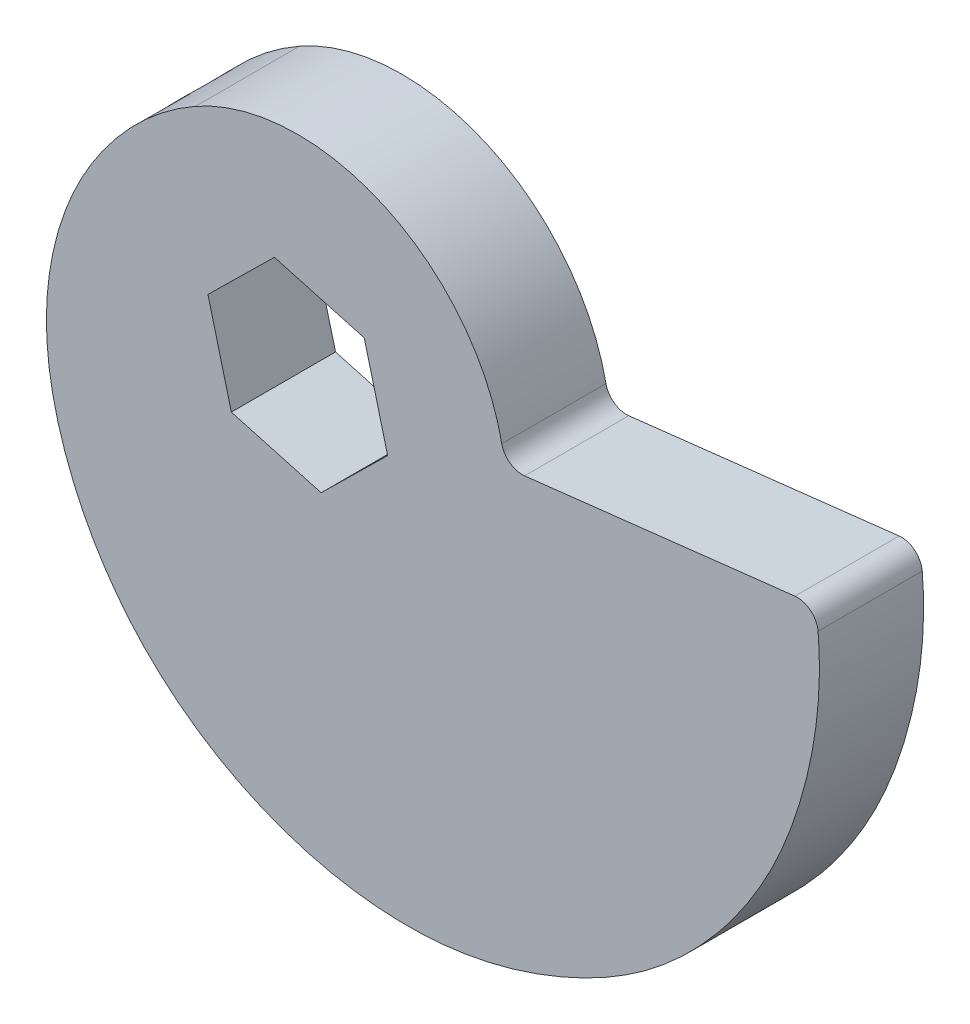
ISO-10303-21;
HEADER;
FILE_DESCRIPTION(('STEP AP214'),'2;1');
FILE_NAME('part.step','',(''),(''),'','','');
FILE_SCHEMA(('AUTOMOTIVE_DESIGN { 1 0 10303 214 1 1 1 1 }'));
ENDSEC;
DATA;
#1=APPLICATION_CONTEXT('core data for automotive mechanical design processes');
#2=APPLICATION_PROTOCOL_DEFINITION('international standard','automotive_design',2000,#1);
#3=PRODUCT_CONTEXT('',#1,'mechanical');
#4=PRODUCT('Part','Part','',(#3));
#5=PRODUCT_RELATED_PRODUCT_CATEGORY('part','',(#4));
#6=PRODUCT_DEFINITION_FORMATION('','',#4);
#7=PRODUCT_DEFINITION_CONTEXT('part definition',#1,'design');
#8=PRODUCT_DEFINITION('design','',#6,#7);
#9=PRODUCT_DEFINITION_SHAPE('','',#8);
#10=(LENGTH_UNIT() NAMED_UNIT(*) SI_UNIT(.MILLI.,.METRE.));
#11=(NAMED_UNIT(*) PLANE_ANGLE_UNIT() SI_UNIT($,.RADIAN.));
#12=(NAMED_UNIT(*) SI_UNIT($,.STERADIAN.) SOLID_ANGLE_UNIT());
#13=UNCERTAINTY_MEASURE_WITH_UNIT(LENGTH_MEASURE(1.E-05),#10,'distance_accuracy_value','');
#14=(GEOMETRIC_REPRESENTATION_CONTEXT(3) GLOBAL_UNCERTAINTY_ASSIGNED_CONTEXT((#13)) GLOBAL_UNIT_ASSIGNED_CONTEXT((#10,
#11,#12)) REPRESENTATION_CONTEXT('',''));
#15=CARTESIAN_POINT('',(0.,0.,0.));
#16=DIRECTION('',(0.,0.,1.));
#17=DIRECTION('',(1.,0.,0.));
#18=AXIS2_PLACEMENT_3D('',#15,#16,#17);
#19=CARTESIAN_POINT('',(6.39104522414917,-25.5969032138321,2.50004646610072));
#20=DIRECTION('',(0.,0.,-1.));
#21=DIRECTION('',(-1.,0.,0.));
#22=AXIS2_PLACEMENT_3D('',#19,#20,#21);
#23=PLANE('',#22);
#24=DIRECTION('',(0.712951939425062,0.701212900672858,0.));
#25=VECTOR('',#24,1.);
#26=CARTESIAN_POINT('',(0.954682237413868,-4.62532314181134,2.50004646610072));
#27=LINE('',#26,#25);
#28=CARTESIAN_POINT('',(0.954682237413868,-4.62532314181134,2.50004646610072));
#29=VERTEX_POINT('',#28);
#30=CARTESIAN_POINT('',(4.14476044204789,-1.48777085035032,2.50004646610072));
#31=VERTEX_POINT('',#30);
#32=EDGE_CURVE('E166',#29,#31,#27,.T.);
#33=ORIENTED_EDGE('',*,*,#32,.T.);
#34=DIRECTION('',(0.9637441551566,-0.266828040883059,0.));
#35=VECTOR('',#34,1.);
#36=CARTESIAN_POINT('',(4.14476044204789,-1.48777085035032,2.50004646610072));
#37=LINE('',#36,#35);
#38=CARTESIAN_POINT('',(8.45699953447222,-2.68168346989192,2.50004646610072));
#39=VERTEX_POINT('',#38);
#40=EDGE_CURVE('E154',#31,#39,#37,.T.);
#41=ORIENTED_EDGE('',*,*,#40,.T.);
#42=DIRECTION('',(0.250792215731538,-0.968040941555917,0.));
#43=VECTOR('',#42,1.);
#44=CARTESIAN_POINT('',(8.45699953447222,-2.68168346989192,2.50004646610072));
#45=LINE('',#44,#43);
#46=CARTESIAN_POINT('',(9.57916042226254,-7.01314838089455,2.50004646610072));
#47=VERTEX_POINT('',#46);
#48=EDGE_CURVE('E157',#39,#47,#45,.T.);
#49=ORIENTED_EDGE('',*,*,#48,.T.);
#50=DIRECTION('',(-0.712951939425062,-0.701212900672858,0.));
#51=VECTOR('',#50,1.);
#52=CARTESIAN_POINT('',(9.57916042226254,-7.01314838089455,2.50004646610072));
#53=LINE('',#52,#51);
#54=CARTESIAN_POINT('',(6.38908221762852,-10.1507006723556,2.50004646610072));
#55=VERTEX_POINT('',#54);
#56=EDGE_CURVE('E57',#47,#55,#53,.T.);
#57=ORIENTED_EDGE('',*,*,#56,.T.);
#58=DIRECTION('',(-0.9637441551566,0.266828040883059,0.));
#59=VECTOR('',#58,1.);
#60=CARTESIAN_POINT('',(6.38908221762852,-10.1507006723556,2.50004646610072));
#61=LINE('',#60,#59);
#62=CARTESIAN_POINT('',(2.07684312520418,-8.95678805281397,2.50004646610072));
#63=VERTEX_POINT('',#62);
#64=EDGE_CURVE('E160',#55,#63,#61,.T.);
#65=ORIENTED_EDGE('',*,*,#64,.T.);
#66=DIRECTION('',(-0.250792215731538,0.968040941555917,0.));
#67=VECTOR('',#66,1.);
#68=CARTESIAN_POINT('',(2.07684312520418,-8.95678805281397,2.50004646610072));
#69=LINE('',#68,#67);
#70=EDGE_CURVE('E163',#63,#29,#69,.T.);
#71=ORIENTED_EDGE('',*,*,#70,.T.);
#72=EDGE_LOOP('',(#33,#41,#49,#57,#65,#71));
#73=FACE_BOUND('',#72,.T.);
#74=CARTESIAN_POINT('',(0.353390612525365,2.89036904541201,2.50004646610072));
#75=CARTESIAN_POINT('',(0.123983940903835,2.76096430758217,2.50004646610072));
#76=CARTESIAN_POINT('',(-0.101256615767782,2.62424580089248,2.50004646610072));
#77=CARTESIAN_POINT('',(-0.542604407307711,2.3373088894999,2.50004646610072));
#78=CARTESIAN_POINT('',(-0.758721886813421,2.18710625335313,2.50004646610072));
#79=CARTESIAN_POINT('',(-1.18148344749409,1.87407818848551,2.50004646610072));
#80=CARTESIAN_POINT('',(-1.38813069527904,1.7112570288203,2.50004646610072));
#81=CARTESIAN_POINT('',(-1.79122690596275,1.37422454507471,2.50004646610072));
#82=CARTESIAN_POINT('',(-1.98769480876975,1.20003584497433,2.50004646610072));
#83=CARTESIAN_POINT('',(-2.37057915068372,0.840847996515578,2.50004646610072));
#84=CARTESIAN_POINT('',(-2.55699287633768,0.655845957612334,2.50004646610072));
#85=CARTESIAN_POINT('',(-2.91944402134544,0.275925069893405,2.50004646610072));
#86=CARTESIAN_POINT('',(-3.0954801352983,0.0810049792061044,2.50004646610072));
#87=CARTESIAN_POINT('',(-3.5212679987724,-0.416423405947175,2.50004646610072));
#88=CARTESIAN_POINT('',(-3.76450763357152,-0.724539475307278,2.50004646610072));
#89=CARTESIAN_POINT('',(-4.2264160510324,-1.35859266365077,2.50004646610072));
#90=CARTESIAN_POINT('',(-4.44508679258879,-1.68452835877842,2.50004646610072));
#91=CARTESIAN_POINT('',(-4.85618425220136,-2.35304713525786,2.50004646610072));
#92=CARTESIAN_POINT('',(-5.04858387500268,-2.69564691702434,2.50004646610072));
#93=CARTESIAN_POINT('',(-5.40503916395577,-3.39527493776606,2.50004646610072));
#94=CARTESIAN_POINT('',(-5.56909676299945,-3.75230219075438,2.50004646610072));
#95=CARTESIAN_POINT('',(-5.87599038473116,-4.50054487525432,2.50004646610072));
#96=CARTESIAN_POINT('',(-6.0169627568817,-4.89252635254371,2.50004646610072));
#97=CARTESIAN_POINT('',(-6.26459711265378,-5.68724492267513,2.50004646610072));
#98=CARTESIAN_POINT('',(-6.37125184072766,-6.0899842705139,2.50004646610072));
#99=CARTESIAN_POINT('',(-6.5496201870115,-6.9026028408385,2.50004646610072));
#100=CARTESIAN_POINT('',(-6.62137637812507,-7.31247272899691,2.50004646610072));
#101=CARTESIAN_POINT('',(-6.72939524763324,-8.13685027939994,2.50004646610072));
#102=CARTESIAN_POINT('',(-6.76566327855103,-8.55135723271487,2.50004646610072));
#103=CARTESIAN_POINT('',(-6.79544827920243,-9.23675760468837,2.50004646610072));
#104=CARTESIAN_POINT('',(-6.79947481032158,-9.50722681283416,2.50004646610072));
#105=CARTESIAN_POINT('',(-6.79371749206978,-9.91274924575641,2.50004646610072));
#106=CARTESIAN_POINT('',(-6.78983178656784,-10.0478988687531,2.50004646610072));
#107=CARTESIAN_POINT('',(-6.77808375377072,-10.318025211181,2.50004646610072));
#108=CARTESIAN_POINT('',(-6.77022138317571,-10.4530019287135,2.50004646610072));
#109=CARTESIAN_POINT('',(-6.74078363505538,-10.8574726736333,2.50004646610072));
#110=CARTESIAN_POINT('',(-6.71335682164958,-11.1265611836619,2.50004646610072));
#111=CARTESIAN_POINT('',(-6.64356840917115,-11.6630551554693,2.50004646610072));
#112=CARTESIAN_POINT('',(-6.6011910023964,-11.9304585297108,2.50004646610072));
#113=CARTESIAN_POINT('',(-6.50225742290502,-12.462655617117,2.50004646610072));
#114=CARTESIAN_POINT('',(-6.44569955531706,-12.7274490143983,2.50004646610072));
#115=CARTESIAN_POINT('',(-6.31917629184135,-13.2538328385381,2.50004646610072));
#116=CARTESIAN_POINT('',(-6.24920935161135,-13.5154228927674,2.50004646610072));
#117=CARTESIAN_POINT('',(-6.09526093495159,-14.0395817759815,2.50004646610072));
#118=CARTESIAN_POINT('',(-6.01104881475505,-14.3020826933279,2.50004646610072));
#119=CARTESIAN_POINT('',(-5.83031298824573,-14.8227745989481,2.50004646610072));
#120=CARTESIAN_POINT('',(-5.73379056787402,-15.0809660342115,2.50004646610072));
#121=CARTESIAN_POINT('',(-5.52867748238735,-15.5924949680415,2.50004646610072));
#122=CARTESIAN_POINT('',(-5.4200874713967,-15.8458327288298,2.50004646610072));
#123=CARTESIAN_POINT('',(-5.19107621170802,-16.3470810725673,2.50004646610072));
#124=CARTESIAN_POINT('',(-5.07065580392923,-16.59499203973,2.50004646610072));
#125=CARTESIAN_POINT('',(-4.81818786569695,-17.0848345794356,2.50004646610072));
#126=CARTESIAN_POINT('',(-4.68613995319966,-17.326765955173,2.50004646610072));
#127=CARTESIAN_POINT('',(-4.41060577791977,-17.8040788295855,2.50004646610072));
#128=CARTESIAN_POINT('',(-4.2671174865364,-18.0394591566057,2.50004646610072));
#129=CARTESIAN_POINT('',(-3.94175408987439,-18.5452407811668,2.50004646610072));
#130=CARTESIAN_POINT('',(-3.75764751870748,-18.8142117419468,2.50004646610072));
#131=CARTESIAN_POINT('',(-3.37409028387822,-19.3410066637705,2.50004646610072));
#132=CARTESIAN_POINT('',(-3.17463841237708,-19.5988297448573,2.50004646610072));
#133=CARTESIAN_POINT('',(-2.76077956213968,-20.1021786423249,2.50004646610072));
#134=CARTESIAN_POINT('',(-2.54637416479266,-20.3477057543449,2.50004646610072));
#135=CARTESIAN_POINT('',(-2.21391213570384,-20.7058034800766,2.50004646610072));
#136=CARTESIAN_POINT('',(-2.10129255282689,-20.8234609508268,2.50004646610072));
#137=CARTESIAN_POINT('',(-1.87252262437447,-21.0552920802454,2.50004646610072));
#138=CARTESIAN_POINT('',(-1.75637225781773,-21.1694657182035,2.50004646610072));
#139=CARTESIAN_POINT('',(-1.40284541513631,-21.5066925082052,2.50004646610072));
#140=CARTESIAN_POINT('',(-1.16038561166323,-21.7244596938592,2.50004646610072));
#141=CARTESIAN_POINT('',(-0.663150020129434,-22.1453733449391,2.50004646610072));
#142=CARTESIAN_POINT('',(-0.408374202156238,-22.3485197748519,2.50004646610072));
#143=CARTESIAN_POINT('',(0.222558939114462,-22.8225934057458,2.50004646610072));
#144=CARTESIAN_POINT('',(0.604501017348826,-23.0858731145116,2.50004646610072));
#145=CARTESIAN_POINT('',(1.38809560165839,-23.5810692560827,2.50004646610072));
#146=CARTESIAN_POINT('',(1.78974668438463,-23.8129879491946,2.50004646610072));
#147=CARTESIAN_POINT('',(2.61052151688794,-24.244757400244,2.50004646610072));
#148=CARTESIAN_POINT('',(3.02966469106421,-24.4445712451022,2.50004646610072));
#149=CARTESIAN_POINT('',(3.88231559729876,-24.8107523087642,2.50004646610072));
#150=CARTESIAN_POINT('',(4.31582381811844,-24.9771183881656,2.50004646610072));
#151=CARTESIAN_POINT('',(5.2224720139174,-25.2851751635429,2.50004646610072));
#152=CARTESIAN_POINT('',(5.69637709729149,-25.4246178223739,2.50004646610072));
#153=CARTESIAN_POINT('',(6.65406409526499,-25.6640829792297,2.50004646610072));
#154=CARTESIAN_POINT('',(7.13784658429982,-25.7641031776739,2.50004646610072));
#155=CARTESIAN_POINT('',(8.11118160924918,-25.924042385515,2.50004646610072));
#156=CARTESIAN_POINT('',(8.60072358792587,-25.9840257715668,2.50004646610072));
#157=CARTESIAN_POINT('',(9.5831397282123,-26.0636921653059,2.50004646610072));
#158=CARTESIAN_POINT('',(10.076013967298,-26.0833742327208,2.50004646610072));
#159=CARTESIAN_POINT('',(10.9056009440458,-26.0820592070445,2.50004646610072));
#160=CARTESIAN_POINT('',(11.2423714095277,-26.071964577599,2.50004646610072));
#161=CARTESIAN_POINT('',(11.9148090413136,-26.0324359523324,2.50004646610072));
#162=CARTESIAN_POINT('',(12.250476251594,-26.0030027369901,2.50004646610072));
#163=CARTESIAN_POINT('',(12.7521790026029,-25.9441478532223,2.50004646610072));
#164=CARTESIAN_POINT('',(12.919107805369,-25.9220797376174,2.50004646610072));
#165=CARTESIAN_POINT('',(13.2522504235761,-25.8730795573428,2.50004646610072));
#166=CARTESIAN_POINT('',(13.4184642379803,-25.8461474856221,2.50004646610072));
#167=CARTESIAN_POINT('',(13.9165204946916,-25.758171397952,2.50004646610072));
#168=CARTESIAN_POINT('',(14.2471312763187,-25.6900241724907,2.50004646610072));
#169=CARTESIAN_POINT('',(14.9042089374813,-25.5359495067034,2.50004646610072));
#170=CARTESIAN_POINT('',(15.2306750487682,-25.4500188196987,2.50004646610072));
#171=CARTESIAN_POINT('',(15.8788018985986,-25.2615104553647,2.50004646610072));
#172=CARTESIAN_POINT('',(16.2004619358724,-25.1589303740794,2.50004646610072));
#173=CARTESIAN_POINT('',(16.842114467708,-24.936937437097,2.50004646610072));
#174=CARTESIAN_POINT('',(17.1620439718251,-24.8173425485573,2.50004646610072));
#175=CARTESIAN_POINT('',(17.6374223242159,-24.6268156645863,2.50004646610072));
#176=CARTESIAN_POINT('',(17.7951274388562,-24.5614517138455,2.50004646610072));
#177=CARTESIAN_POINT('',(18.1090087148263,-24.4271501777236,2.50004646610072));
#178=CARTESIAN_POINT('',(18.2651848691681,-24.3582125760189,2.50004646610072));
#179=CARTESIAN_POINT('',(18.7313156620368,-24.1460441332238,2.50004646610072));
#180=CARTESIAN_POINT('',(19.0388607983528,-23.997462398683,2.50004646610072));
#181=CARTESIAN_POINT('',(19.6458744456807,-23.6855787734643,2.50004646610072));
#182=CARTESIAN_POINT('',(19.9453532226533,-23.5222968652312,2.50004646610072));
#183=CARTESIAN_POINT('',(20.5353311586136,-23.1802892078041,2.50004646610072));
#184=CARTESIAN_POINT('',(20.8258320914623,-23.0015665362593,2.50004646610072));
#185=CARTESIAN_POINT('',(21.2537199644104,-22.7215950791144,2.50004646610072));
#186=CARTESIAN_POINT('',(21.3950279849721,-22.6262978909454,2.50004646610072));
#187=CARTESIAN_POINT('',(21.6748396054139,-22.4316629670217,2.50004646610072));
#188=CARTESIAN_POINT('',(21.8133431955299,-22.3323252172028,2.50004646610072));
#189=CARTESIAN_POINT('',(22.103012983889,-22.1182006687457,2.50004646610072));
#190=CARTESIAN_POINT('',(22.2538298178074,-22.0029409795211,2.50004646610072));
#191=CARTESIAN_POINT('',(22.5518100979576,-21.7677982894601,2.50004646610072));
#192=CARTESIAN_POINT('',(22.6989734627507,-21.6479151857158,2.50004646610072));
#193=CARTESIAN_POINT('',(23.1350595313018,-21.2815499073454,2.50004646610072));
#194=CARTESIAN_POINT('',(23.4184567194692,-21.028441887622,2.50004646610072));
#195=CARTESIAN_POINT('',(23.9702797814606,-20.5063472798066,2.50004646610072));
#196=CARTESIAN_POINT('',(24.2387020810499,-20.2373569321587,2.50004646610072));
#197=CARTESIAN_POINT('',(24.7608670845812,-19.684810918433,2.50004646610072));
#198=CARTESIAN_POINT('',(25.014589563718,-19.4012361529564,2.50004646610072));
#199=CARTESIAN_POINT('',(25.5063037217274,-18.8208877645762,2.50004646610072));
#200=CARTESIAN_POINT('',(25.7442997607507,-18.5241178385228,2.50004646610072));
#201=CARTESIAN_POINT('',(26.2039301476912,-17.9181976866504,2.50004646610072));
#202=CARTESIAN_POINT('',(26.4255641712303,-17.6090472155735,2.50004646610072));
#203=CARTESIAN_POINT('',(26.9557156726698,-16.8255681656375,2.50004646610072));
#204=CARTESIAN_POINT('',(27.2539284522599,-16.3441738018274,2.50004646610072));
#205=CARTESIAN_POINT('',(27.6709165671172,-15.6051785915568,2.50004646610072));
#206=CARTESIAN_POINT('',(27.8048702753976,-15.3560017154801,2.50004646610072));
#207=CARTESIAN_POINT('',(28.0623289997195,-14.8523168190325,2.50004646610072));
#208=CARTESIAN_POINT('',(28.1858354483967,-14.597809535613,2.50004646610072));
#209=CARTESIAN_POINT('',(28.3826653952803,-14.1696720024962,2.50004646610072));
#210=CARTESIAN_POINT('',(28.4589772093451,-13.997406582179,2.50004646610072));
#211=CARTESIAN_POINT('',(28.6068961036509,-13.650911523678,2.50004646610072));
#212=CARTESIAN_POINT('',(28.6785041454888,-13.4766822955435,2.50004646610072));
#213=CARTESIAN_POINT('',(28.8864255109505,-12.9511327685495,2.50004646610072));
#214=CARTESIAN_POINT('',(29.0157941957602,-12.5970420419609,2.50004646610072));
#215=CARTESIAN_POINT('',(29.2566199373354,-11.8826495687592,2.50004646610072));
#216=CARTESIAN_POINT('',(29.3680679468592,-11.5223447859812,2.50004646610072));
#217=CARTESIAN_POINT('',(29.5258394303464,-10.9658751529669,2.50004646610072));
#218=CARTESIAN_POINT('',(29.5783160698774,-10.7714335911405,2.50004646610072));
#219=CARTESIAN_POINT('',(29.6782820609645,-10.3812726877155,2.50004646610072));
#220=CARTESIAN_POINT('',(29.7257714027541,-10.1855533436154,2.50004646610072));
#221=CARTESIAN_POINT('',(29.86041539291,-9.59676260642383,2.50004646610072));
#222=CARTESIAN_POINT('',(29.9397977179465,-9.20187708438399,2.50004646610072));
#223=CARTESIAN_POINT('',(30.0761789549817,-8.40852148304292,2.50004646610072));
#224=CARTESIAN_POINT('',(30.1331927481033,-8.01005396786777,2.50004646610072));
#225=CARTESIAN_POINT('',(30.2232420849246,-7.20987934969979,2.50004646610072));
#226=CARTESIAN_POINT('',(30.2562475171505,-6.80816881521826,2.50004646610072));
#227=CARTESIAN_POINT('',(30.2963625265255,-6.00313092375782,2.50004646610072));
#228=CARTESIAN_POINT('',(30.3034544538208,-5.59980265204231,2.50004646610072));
#229=CARTESIAN_POINT('',(30.2899207114876,-4.79262260974569,2.50004646610072));
#230=CARTESIAN_POINT('',(30.269225672244,-4.38877205290349,2.50004646610072));
#231=CARTESIAN_POINT('',(30.2337263705481,-3.98608657958074,2.50004646610072));
#232=B_SPLINE_CURVE_WITH_KNOTS('',3,(#74,#75,#76,#77,#78,#79,#80,#81,#82,#83,#84,#85,#86,#87,
#88,#89,#90,#91,#92,#93,#94,#95,#96,#97,#98,#99,#100,#101,#102,#103,#104,#105,#106,#107,#108,
#109,#110,#111,#112,#113,#114,#115,#116,#117,#118,#119,#120,#121,#122,#123,#124,#125,#126,#127,
#128,#129,#130,#131,#132,#133,#134,#135,#136,#137,#138,#139,#140,#141,#142,#143,#144,#145,#146,
#147,#148,#149,#150,#151,#152,#153,#154,#155,#156,#157,#158,#159,#160,#161,#162,#163,#164,#165,
#166,#167,#168,#169,#170,#171,#172,#173,#174,#175,#176,#177,#178,#179,#180,#181,#182,#183,#184,
#185,#186,#187,#188,#189,#190,#191,#192,#193,#194,#195,#196,#197,#198,#199,#200,#201,#202,#203,
#204,#205,#206,#207,#208,#209,#210,#211,#212,#213,#214,#215,#216,#217,#218,#219,#220,#221,#222,
#223,#224,#225,#226,#227,#228,#229,#230,#231),.UNSPECIFIED.,.F.,.F.,(4,2,2,2,2,2,2,2,2,2,2,2,2,
2,2,2,2,2,2,2,2,2,2,2,2,2,2,2,2,2,2,2,2,2,2,2,2,2,2,2,2,2,2,2,2,2,2,2,2,2,2,2,2,2,2,2,2,2,2,2,2,
2,2,2,2,2,2,2,2,2,2,2,2,2,2,2,2,2,4),(0.,0.789977244172034,1.57904241982765,2.36784179734213,
3.15511652982827,3.9426026821029,4.73018768190458,5.90659187861287,7.08290221315156,
8.26041674052118,9.43785093108776,10.6859239370665,11.9342606415707,13.1810706499821,
14.427692578522,15.2387480366312,15.6443100511352,16.0498764816876,16.8608479030121,
17.6726793708556,18.4846079163874,19.2966300291588,20.1233428492216,20.9499693810093,
21.7765511273031,22.6030741615968,23.4296243630188,24.2563214551559,25.2335983510991,
26.2109522480065,27.1882029424847,27.6767448430186,28.1652896472238,29.1423458947008,
30.1194045153193,31.5094768754069,32.8994489942845,34.2910079938673,35.682614389058,
37.1629010952869,38.6432741364332,40.1212610601819,41.5992824665329,42.6095569023525,
43.6197905673927,44.124872294123,44.6299547530261,45.6420697504332,46.6543696902195,
47.6668159231876,48.6910468818973,49.2031512558037,49.7152579690975,50.7395096039395,
51.7623893755743,52.7850657353609,53.2963244087946,53.8075848619454,54.3769368246849,
54.9463014673819,56.0854837914351,57.2249368645226,58.3659221443866,59.5065897475197,
60.6472799583925,62.3439477898477,63.1924652528672,64.0408661691549,64.6060350273865,
65.1710879856658,66.3014951628939,67.4324712457755,68.0366091965267,68.6407483303032,
69.8484613405835,71.0553695271544,72.2637888296317,73.4730310409603,74.6852977215313),.UNSPECIFIED.);
#233=CARTESIAN_POINT('',(0.353390612525365,2.89036904541201,2.50004646610072));
#234=VERTEX_POINT('',#233);
#235=CARTESIAN_POINT('',(30.2337263705482,-3.98608657958074,2.50004646610072));
#236=VERTEX_POINT('',#235);
#237=EDGE_CURVE('E171',#234,#236,#232,.T.);
#238=ORIENTED_EDGE('',*,*,#237,.T.);
#239=CARTESIAN_POINT('',(29.2375847632499,-4.07384703883867,2.50004646610072));
#240=DIRECTION('',(0.,0.,1.));
#241=DIRECTION('',(1.,0.,0.));
#242=AXIS2_PLACEMENT_3D('',#239,#240,#241);
#243=CIRCLE('',#242,0.999999999999997);
#244=CARTESIAN_POINT('',(29.1235287264493,-3.08037272086696,2.50004646610072));
#245=VERTEX_POINT('',#244);
#246=EDGE_CURVE('E178',#236,#245,#243,.T.);
#247=ORIENTED_EDGE('',*,*,#246,.T.);
#248=DIRECTION('',(-0.993474317971706,-0.114056036800574,0.));
#249=VECTOR('',#248,1.);
#250=CARTESIAN_POINT('',(29.1235287264493,-3.08037272086696,2.50004646610072));
#251=LINE('',#250,#249);
#252=CARTESIAN_POINT('',(16.1498872149415,-4.56981447784667,2.50004646610072));
#253=VERTEX_POINT('',#252);
#254=EDGE_CURVE('E181',#245,#253,#251,.T.);
#255=ORIENTED_EDGE('',*,*,#254,.T.);
#256=CARTESIAN_POINT('',(16.0358311781409,-3.57634015987496,2.50004646610072));
#257=DIRECTION('',(0.,0.,-1.));
#258=DIRECTION('',(1.,0.,0.));
#259=AXIS2_PLACEMENT_3D('',#256,#257,#258);
#260=CIRCLE('',#259,0.999999999999999);
#261=CARTESIAN_POINT('',(15.0568393737497,-3.78023976000932,2.50004646610072));
#262=VERTEX_POINT('',#261);
#263=EDGE_CURVE('E184',#253,#262,#260,.T.);
#264=ORIENTED_EDGE('',*,*,#263,.T.);
#265=CARTESIAN_POINT('',(5.2669213298382,-5.81923576135294,2.50004646610072));
#266=DIRECTION('',(0.,0.,1.));
#267=DIRECTION('',(1.,0.,0.));
#268=AXIS2_PLACEMENT_3D('',#265,#266,#267);
#269=CIRCLE('',#268,10.);
#270=EDGE_CURVE('E187',#262,#234,#269,.T.);
#271=ORIENTED_EDGE('',*,*,#270,.T.);
#272=EDGE_LOOP('',(#238,#247,#255,#264,#271));
#273=FACE_BOUND('',#272,.T.);
#274=ADVANCED_FACE('F40',(#73,#273),#23,.F.);
#275=CARTESIAN_POINT('',(6.39104522414917,-25.5969032138321,-2.49995353389928));
#276=DIRECTION('',(0.,0.,-1.));
#277=DIRECTION('',(-1.,0.,0.));
#278=AXIS2_PLACEMENT_3D('',#275,#276,#277);
#279=PLANE('',#278);
#280=DIRECTION('',(0.9637441551566,-0.266828040883059,0.));
#281=VECTOR('',#280,1.);
#282=CARTESIAN_POINT('',(4.14476044204789,-1.48777085035032,-2.49995353389928));
#283=LINE('',#282,#281);
#284=CARTESIAN_POINT('',(4.14476044204789,-1.48777085035032,-2.49995353389928));
#285=VERTEX_POINT('',#284);
#286=CARTESIAN_POINT('',(8.45699953447222,-2.68168346989192,-2.49995353389928));
#287=VERTEX_POINT('',#286);
#288=EDGE_CURVE('E65',#285,#287,#283,.T.);
#289=ORIENTED_EDGE('',*,*,#288,.F.);
#290=DIRECTION('',(0.712951939425062,0.701212900672858,0.));
#291=VECTOR('',#290,1.);
#292=CARTESIAN_POINT('',(0.954682237413868,-4.62532314181134,-2.49995353389928));
#293=LINE('',#292,#291);
#294=CARTESIAN_POINT('',(0.954682237413868,-4.62532314181134,-2.49995353389928));
#295=VERTEX_POINT('',#294);
#296=EDGE_CURVE('E151',#295,#285,#293,.T.);
#297=ORIENTED_EDGE('',*,*,#296,.F.);
#298=DIRECTION('',(-0.250792215731538,0.968040941555917,0.));
#299=VECTOR('',#298,1.);
#300=CARTESIAN_POINT('',(2.07684312520418,-8.95678805281397,-2.49995353389928));
#301=LINE('',#300,#299);
#302=CARTESIAN_POINT('',(2.07684312520418,-8.95678805281397,-2.49995353389928));
#303=VERTEX_POINT('',#302);
#304=EDGE_CURVE('E145',#303,#295,#301,.T.);
#305=ORIENTED_EDGE('',*,*,#304,.F.);
#306=DIRECTION('',(-0.9637441551566,0.266828040883059,0.));
#307=VECTOR('',#306,1.);
#308=CARTESIAN_POINT('',(6.38908221762852,-10.1507006723556,-2.49995353389928));
#309=LINE('',#308,#307);
#310=CARTESIAN_POINT('',(6.38908221762852,-10.1507006723556,-2.49995353389928));
#311=VERTEX_POINT('',#310);
#312=EDGE_CURVE('E143',#311,#303,#309,.T.);
#313=ORIENTED_EDGE('',*,*,#312,.F.);
#314=DIRECTION('',(-0.712951939425062,-0.701212900672858,0.));
#315=VECTOR('',#314,1.);
#316=CARTESIAN_POINT('',(9.57916042226254,-7.01314838089455,-2.49995353389928));
#317=LINE('',#316,#315);
#318=CARTESIAN_POINT('',(9.57916042226254,-7.01314838089455,-2.49995353389928));
#319=VERTEX_POINT('',#318);
#320=EDGE_CURVE('E126',#319,#311,#317,.T.);
#321=ORIENTED_EDGE('',*,*,#320,.F.);
#322=DIRECTION('',(0.250792215731538,-0.968040941555917,0.));
#323=VECTOR('',#322,1.);
#324=CARTESIAN_POINT('',(8.45699953447222,-2.68168346989192,-2.49995353389928));
#325=LINE('',#324,#323);
#326=EDGE_CURVE('E135',#287,#319,#325,.T.);
#327=ORIENTED_EDGE('',*,*,#326,.F.);
#328=EDGE_LOOP('',(#289,#297,#305,#313,#321,#327));
#329=FACE_BOUND('',#328,.T.);
#330=CARTESIAN_POINT('',(0.353390612525365,2.89036904541201,-2.49995353389928));
#331=CARTESIAN_POINT('',(0.123983940903835,2.76096430758217,-2.49995353389928));
#332=CARTESIAN_POINT('',(-0.101256615767782,2.62424580089248,-2.49995353389928));
#333=CARTESIAN_POINT('',(-0.542604407307711,2.3373088894999,-2.49995353389928));
#334=CARTESIAN_POINT('',(-0.758721886813421,2.18710625335313,-2.49995353389928));
#335=CARTESIAN_POINT('',(-1.18148344749409,1.87407818848551,-2.49995353389928));
#336=CARTESIAN_POINT('',(-1.38813069527904,1.7112570288203,-2.49995353389928));
#337=CARTESIAN_POINT('',(-1.79122690596275,1.37422454507471,-2.49995353389928));
#338=CARTESIAN_POINT('',(-1.98769480876975,1.20003584497433,-2.49995353389928));
#339=CARTESIAN_POINT('',(-2.37057915068372,0.840847996515578,-2.49995353389928));
#340=CARTESIAN_POINT('',(-2.55699287633768,0.655845957612334,-2.49995353389928));
#341=CARTESIAN_POINT('',(-2.91944402134544,0.275925069893405,-2.49995353389928));
#342=CARTESIAN_POINT('',(-3.0954801352983,0.0810049792061044,-2.49995353389928));
#343=CARTESIAN_POINT('',(-3.5212679987724,-0.416423405947175,-2.49995353389928));
#344=CARTESIAN_POINT('',(-3.76450763357152,-0.724539475307278,-2.49995353389928));
#345=CARTESIAN_POINT('',(-4.2264160510324,-1.35859266365077,-2.49995353389928));
#346=CARTESIAN_POINT('',(-4.44508679258879,-1.68452835877842,-2.49995353389928));
#347=CARTESIAN_POINT('',(-4.85618425220136,-2.35304713525786,-2.49995353389928));
#348=CARTESIAN_POINT('',(-5.04858387500268,-2.69564691702434,-2.49995353389928));
#349=CARTESIAN_POINT('',(-5.40503916395577,-3.39527493776606,-2.49995353389928));
#350=CARTESIAN_POINT('',(-5.56909676299945,-3.75230219075438,-2.49995353389928));
#351=CARTESIAN_POINT('',(-5.87599038473116,-4.50054487525432,-2.49995353389928));
#352=CARTESIAN_POINT('',(-6.0169627568817,-4.89252635254371,-2.49995353389928));
#353=CARTESIAN_POINT('',(-6.26459711265378,-5.68724492267513,-2.49995353389928));
#354=CARTESIAN_POINT('',(-6.37125184072766,-6.0899842705139,-2.49995353389928));
#355=CARTESIAN_POINT('',(-6.5496201870115,-6.9026028408385,-2.49995353389928));
#356=CARTESIAN_POINT('',(-6.62137637812507,-7.31247272899691,-2.49995353389928));
#357=CARTESIAN_POINT('',(-6.72939524763324,-8.13685027939994,-2.49995353389928));
#358=CARTESIAN_POINT('',(-6.76566327855103,-8.55135723271487,-2.49995353389928));
#359=CARTESIAN_POINT('',(-6.79544827920243,-9.23675760468837,-2.49995353389928));
#360=CARTESIAN_POINT('',(-6.79947481032158,-9.50722681283416,-2.49995353389928));
#361=CARTESIAN_POINT('',(-6.79371749206978,-9.91274924575641,-2.49995353389928));
#362=CARTESIAN_POINT('',(-6.78983178656784,-10.0478988687531,-2.49995353389928));
#363=CARTESIAN_POINT('',(-6.77808375377072,-10.318025211181,-2.49995353389928));
#364=CARTESIAN_POINT('',(-6.77022138317571,-10.4530019287135,-2.49995353389928));
#365=CARTESIAN_POINT('',(-6.74078363505538,-10.8574726736333,-2.49995353389928));
#366=CARTESIAN_POINT('',(-6.71335682164958,-11.1265611836619,-2.49995353389928));
#367=CARTESIAN_POINT('',(-6.64356840917115,-11.6630551554693,-2.49995353389928));
#368=CARTESIAN_POINT('',(-6.6011910023964,-11.9304585297108,-2.49995353389928));
#369=CARTESIAN_POINT('',(-6.50225742290502,-12.462655617117,-2.49995353389928));
#370=CARTESIAN_POINT('',(-6.44569955531706,-12.7274490143983,-2.49995353389928));
#371=CARTESIAN_POINT('',(-6.31917629184135,-13.2538328385381,-2.49995353389928));
#372=CARTESIAN_POINT('',(-6.24920935161135,-13.5154228927674,-2.49995353389928));
#373=CARTESIAN_POINT('',(-6.09526093495159,-14.0395817759815,-2.49995353389928));
#374=CARTESIAN_POINT('',(-6.01104881475505,-14.3020826933279,-2.49995353389928));
#375=CARTESIAN_POINT('',(-5.83031298824573,-14.8227745989481,-2.49995353389928));
#376=CARTESIAN_POINT('',(-5.73379056787402,-15.0809660342115,-2.49995353389928));
#377=CARTESIAN_POINT('',(-5.52867748238735,-15.5924949680415,-2.49995353389928));
#378=CARTESIAN_POINT('',(-5.4200874713967,-15.8458327288298,-2.49995353389928));
#379=CARTESIAN_POINT('',(-5.19107621170802,-16.3470810725673,-2.49995353389928));
#380=CARTESIAN_POINT('',(-5.07065580392923,-16.59499203973,-2.49995353389928));
#381=CARTESIAN_POINT('',(-4.81818786569695,-17.0848345794356,-2.49995353389928));
#382=CARTESIAN_POINT('',(-4.68613995319966,-17.326765955173,-2.49995353389928));
#383=CARTESIAN_POINT('',(-4.41060577791977,-17.8040788295855,-2.49995353389928));
#384=CARTESIAN_POINT('',(-4.2671174865364,-18.0394591566057,-2.49995353389928));
#385=CARTESIAN_POINT('',(-3.94175408987439,-18.5452407811668,-2.49995353389928));
#386=CARTESIAN_POINT('',(-3.75764751870748,-18.8142117419468,-2.49995353389928));
#387=CARTESIAN_POINT('',(-3.37409028387822,-19.3410066637705,-2.49995353389928));
#388=CARTESIAN_POINT('',(-3.17463841237708,-19.5988297448573,-2.49995353389928));
#389=CARTESIAN_POINT('',(-2.76077956213968,-20.1021786423249,-2.49995353389928));
#390=CARTESIAN_POINT('',(-2.54637416479266,-20.3477057543449,-2.49995353389928));
#391=CARTESIAN_POINT('',(-2.21391213570384,-20.7058034800766,-2.49995353389928));
#392=CARTESIAN_POINT('',(-2.10129255282689,-20.8234609508268,-2.49995353389928));
#393=CARTESIAN_POINT('',(-1.87252262437447,-21.0552920802454,-2.49995353389928));
#394=CARTESIAN_POINT('',(-1.75637225781773,-21.1694657182035,-2.49995353389928));
#395=CARTESIAN_POINT('',(-1.40284541513631,-21.5066925082052,-2.49995353389928));
#396=CARTESIAN_POINT('',(-1.16038561166323,-21.7244596938592,-2.49995353389928));
#397=CARTESIAN_POINT('',(-0.663150020129434,-22.1453733449391,-2.49995353389928));
#398=CARTESIAN_POINT('',(-0.408374202156238,-22.3485197748519,-2.49995353389928));
#399=CARTESIAN_POINT('',(0.222558939114462,-22.8225934057458,-2.49995353389928));
#400=CARTESIAN_POINT('',(0.604501017348826,-23.0858731145116,-2.49995353389928));
#401=CARTESIAN_POINT('',(1.38809560165839,-23.5810692560827,-2.49995353389928));
#402=CARTESIAN_POINT('',(1.78974668438463,-23.8129879491946,-2.49995353389928));
#403=CARTESIAN_POINT('',(2.61052151688794,-24.244757400244,-2.49995353389928));
#404=CARTESIAN_POINT('',(3.02966469106421,-24.4445712451022,-2.49995353389928));
#405=CARTESIAN_POINT('',(3.88231559729876,-24.8107523087642,-2.49995353389928));
#406=CARTESIAN_POINT('',(4.31582381811844,-24.9771183881656,-2.49995353389928));
#407=CARTESIAN_POINT('',(5.2224720139174,-25.2851751635429,-2.49995353389928));
#408=CARTESIAN_POINT('',(5.69637709729149,-25.4246178223739,-2.49995353389928));
#409=CARTESIAN_POINT('',(6.65406409526499,-25.6640829792297,-2.49995353389928));
#410=CARTESIAN_POINT('',(7.13784658429982,-25.7641031776739,-2.49995353389928));
#411=CARTESIAN_POINT('',(8.11118160924918,-25.924042385515,-2.49995353389928));
#412=CARTESIAN_POINT('',(8.60072358792587,-25.9840257715668,-2.49995353389928));
#413=CARTESIAN_POINT('',(9.5831397282123,-26.0636921653059,-2.49995353389928));
#414=CARTESIAN_POINT('',(10.076013967298,-26.0833742327208,-2.49995353389928));
#415=CARTESIAN_POINT('',(10.9056009440458,-26.0820592070445,-2.49995353389928));
#416=CARTESIAN_POINT('',(11.2423714095277,-26.071964577599,-2.49995353389928));
#417=CARTESIAN_POINT('',(11.9148090413136,-26.0324359523324,-2.49995353389928));
#418=CARTESIAN_POINT('',(12.250476251594,-26.0030027369901,-2.49995353389928));
#419=CARTESIAN_POINT('',(12.7521790026029,-25.9441478532223,-2.49995353389928));
#420=CARTESIAN_POINT('',(12.919107805369,-25.9220797376174,-2.49995353389928));
#421=CARTESIAN_POINT('',(13.2522504235761,-25.8730795573428,-2.49995353389928));
#422=CARTESIAN_POINT('',(13.4184642379803,-25.8461474856221,-2.49995353389928));
#423=CARTESIAN_POINT('',(13.9165204946916,-25.758171397952,-2.49995353389928));
#424=CARTESIAN_POINT('',(14.2471312763187,-25.6900241724907,-2.49995353389928));
#425=CARTESIAN_POINT('',(14.9042089374813,-25.5359495067034,-2.49995353389928));
#426=CARTESIAN_POINT('',(15.2306750487682,-25.4500188196987,-2.49995353389928));
#427=CARTESIAN_POINT('',(15.8788018985986,-25.2615104553647,-2.49995353389928));
#428=CARTESIAN_POINT('',(16.2004619358724,-25.1589303740794,-2.49995353389928));
#429=CARTESIAN_POINT('',(16.842114467708,-24.936937437097,-2.49995353389928));
#430=CARTESIAN_POINT('',(17.1620439718251,-24.8173425485573,-2.49995353389928));
#431=CARTESIAN_POINT('',(17.6374223242159,-24.6268156645863,-2.49995353389928));
#432=CARTESIAN_POINT('',(17.7951274388562,-24.5614517138455,-2.49995353389928));
#433=CARTESIAN_POINT('',(18.1090087148263,-24.4271501777236,-2.49995353389928));
#434=CARTESIAN_POINT('',(18.2651848691681,-24.3582125760189,-2.49995353389928));
#435=CARTESIAN_POINT('',(18.7313156620368,-24.1460441332238,-2.49995353389928));
#436=CARTESIAN_POINT('',(19.0388607983528,-23.997462398683,-2.49995353389928));
#437=CARTESIAN_POINT('',(19.6458744456807,-23.6855787734643,-2.49995353389928));
#438=CARTESIAN_POINT('',(19.9453532226533,-23.5222968652312,-2.49995353389928));
#439=CARTESIAN_POINT('',(20.5353311586136,-23.1802892078041,-2.49995353389928));
#440=CARTESIAN_POINT('',(20.8258320914623,-23.0015665362593,-2.49995353389928));
#441=CARTESIAN_POINT('',(21.2537199644104,-22.7215950791144,-2.49995353389928));
#442=CARTESIAN_POINT('',(21.3950279849721,-22.6262978909454,-2.49995353389928));
#443=CARTESIAN_POINT('',(21.6748396054139,-22.4316629670217,-2.49995353389928));
#444=CARTESIAN_POINT('',(21.8133431955299,-22.3323252172028,-2.49995353389928));
#445=CARTESIAN_POINT('',(22.103012983889,-22.1182006687457,-2.49995353389928));
#446=CARTESIAN_POINT('',(22.2538298178074,-22.0029409795211,-2.49995353389928));
#447=CARTESIAN_POINT('',(22.5518100979576,-21.7677982894601,-2.49995353389928));
#448=CARTESIAN_POINT('',(22.6989734627507,-21.6479151857158,-2.49995353389928));
#449=CARTESIAN_POINT('',(23.1350595313018,-21.2815499073454,-2.49995353389928));
#450=CARTESIAN_POINT('',(23.4184567194692,-21.028441887622,-2.49995353389928));
#451=CARTESIAN_POINT('',(23.9702797814606,-20.5063472798066,-2.49995353389928));
#452=CARTESIAN_POINT('',(24.2387020810499,-20.2373569321587,-2.49995353389928));
#453=CARTESIAN_POINT('',(24.7608670845812,-19.684810918433,-2.49995353389928));
#454=CARTESIAN_POINT('',(25.014589563718,-19.4012361529564,-2.49995353389928));
#455=CARTESIAN_POINT('',(25.5063037217274,-18.8208877645762,-2.49995353389928));
#456=CARTESIAN_POINT('',(25.7442997607507,-18.5241178385228,-2.49995353389928));
#457=CARTESIAN_POINT('',(26.2039301476912,-17.9181976866504,-2.49995353389928));
#458=CARTESIAN_POINT('',(26.4255641712303,-17.6090472155735,-2.49995353389928));
#459=CARTESIAN_POINT('',(26.9557156726698,-16.8255681656375,-2.49995353389928));
#460=CARTESIAN_POINT('',(27.2539284522599,-16.3441738018274,-2.49995353389928));
#461=CARTESIAN_POINT('',(27.6709165671172,-15.6051785915568,-2.49995353389928));
#462=CARTESIAN_POINT('',(27.8048702753976,-15.3560017154801,-2.49995353389928));
#463=CARTESIAN_POINT('',(28.0623289997195,-14.8523168190325,-2.49995353389928));
#464=CARTESIAN_POINT('',(28.1858354483967,-14.597809535613,-2.49995353389928));
#465=CARTESIAN_POINT('',(28.3826653952803,-14.1696720024962,-2.49995353389928));
#466=CARTESIAN_POINT('',(28.4589772093451,-13.997406582179,-2.49995353389928));
#467=CARTESIAN_POINT('',(28.6068961036509,-13.650911523678,-2.49995353389928));
#468=CARTESIAN_POINT('',(28.6785041454888,-13.4766822955435,-2.49995353389928));
#469=CARTESIAN_POINT('',(28.8864255109505,-12.9511327685495,-2.49995353389928));
#470=CARTESIAN_POINT('',(29.0157941957602,-12.5970420419609,-2.49995353389928));
#471=CARTESIAN_POINT('',(29.2566199373354,-11.8826495687592,-2.49995353389928));
#472=CARTESIAN_POINT('',(29.3680679468592,-11.5223447859812,-2.49995353389928));
#473=CARTESIAN_POINT('',(29.5258394303464,-10.9658751529669,-2.49995353389928));
#474=CARTESIAN_POINT('',(29.5783160698774,-10.7714335911405,-2.49995353389928));
#475=CARTESIAN_POINT('',(29.6782820609645,-10.3812726877155,-2.49995353389928));
#476=CARTESIAN_POINT('',(29.7257714027541,-10.1855533436154,-2.49995353389928));
#477=CARTESIAN_POINT('',(29.86041539291,-9.59676260642383,-2.49995353389928));
#478=CARTESIAN_POINT('',(29.9397977179465,-9.20187708438399,-2.49995353389928));
#479=CARTESIAN_POINT('',(30.0761789549817,-8.40852148304292,-2.49995353389928));
#480=CARTESIAN_POINT('',(30.1331927481033,-8.01005396786777,-2.49995353389928));
#481=CARTESIAN_POINT('',(30.2232420849246,-7.20987934969979,-2.49995353389928));
#482=CARTESIAN_POINT('',(30.2562475171505,-6.80816881521826,-2.49995353389928));
#483=CARTESIAN_POINT('',(30.2963625265255,-6.00313092375782,-2.49995353389928));
#484=CARTESIAN_POINT('',(30.3034544538208,-5.59980265204231,-2.49995353389928));
#485=CARTESIAN_POINT('',(30.2899207114876,-4.79262260974569,-2.49995353389928));
#486=CARTESIAN_POINT('',(30.269225672244,-4.38877205290349,-2.49995353389928));
#487=CARTESIAN_POINT('',(30.2337263705481,-3.98608657958074,-2.49995353389928));
#488=B_SPLINE_CURVE_WITH_KNOTS('',3,(#330,#331,#332,#333,#334,#335,#336,#337,#338,#339,#340,
#341,#342,#343,#344,#345,#346,#347,#348,#349,#350,#351,#352,#353,#354,#355,#356,#357,#358,#359,
#360,#361,#362,#363,#364,#365,#366,#367,#368,#369,#370,#371,#372,#373,#374,#375,#376,#377,#378,
#379,#380,#381,#382,#383,#384,#385,#386,#387,#388,#389,#390,#391,#392,#393,#394,#395,#396,#397,
#398,#399,#400,#401,#402,#403,#404,#405,#406,#407,#408,#409,#410,#411,#412,#413,#414,#415,#416,
#417,#418,#419,#420,#421,#422,#423,#424,#425,#426,#427,#428,#429,#430,#431,#432,#433,#434,#435,
#436,#437,#438,#439,#440,#441,#442,#443,#444,#445,#446,#447,#448,#449,#450,#451,#452,#453,#454,
#455,#456,#457,#458,#459,#460,#461,#462,#463,#464,#465,#466,#467,#468,#469,#470,#471,#472,#473,
#474,#475,#476,#477,#478,#479,#480,#481,#482,#483,#484,#485,#486,#487),.UNSPECIFIED.,.F.,.F.,(4,
2,2,2,2,2,2,2,2,2,2,2,2,2,2,2,2,2,2,2,2,2,2,2,2,2,2,2,2,2,2,2,2,2,2,2,2,2,2,2,2,2,2,2,2,2,2,2,2,
2,2,2,2,2,2,2,2,2,2,2,2,2,2,2,2,2,2,2,2,2,2,2,2,2,2,2,2,2,4),(0.,0.789977244172034,
1.57904241982765,2.36784179734213,3.15511652982827,3.9426026821029,4.73018768190458,
5.90659187861287,7.08290221315156,8.26041674052118,9.43785093108776,10.6859239370665,
11.9342606415707,13.1810706499821,14.427692578522,15.2387480366312,15.6443100511352,
16.0498764816876,16.8608479030121,17.6726793708556,18.4846079163874,19.2966300291588,
20.1233428492216,20.9499693810093,21.7765511273031,22.6030741615968,23.4296243630188,
24.2563214551559,25.2335983510991,26.2109522480065,27.1882029424847,27.6767448430186,
28.1652896472238,29.1423458947008,30.1194045153193,31.5094768754069,32.8994489942845,
34.2910079938673,35.682614389058,37.1629010952869,38.6432741364332,40.1212610601819,
41.5992824665329,42.6095569023525,43.6197905673927,44.124872294123,44.6299547530261,
45.6420697504332,46.6543696902195,47.6668159231876,48.6910468818973,49.2031512558037,
49.7152579690975,50.7395096039395,51.7623893755743,52.7850657353609,53.2963244087946,
53.8075848619454,54.3769368246849,54.9463014673819,56.0854837914351,57.2249368645226,
58.3659221443866,59.5065897475197,60.6472799583925,62.3439477898477,63.1924652528672,
64.0408661691549,64.6060350273865,65.1710879856658,66.3014951628939,67.4324712457755,
68.0366091965267,68.6407483303032,69.8484613405835,71.0553695271544,72.2637888296317,
73.4730310409603,74.6852977215313),.UNSPECIFIED.);
#489=CARTESIAN_POINT('',(0.353390612525365,2.89036904541201,-2.49995353389928));
#490=VERTEX_POINT('',#489);
#491=CARTESIAN_POINT('',(30.2337263705482,-3.98608657958074,-2.49995353389928));
#492=VERTEX_POINT('',#491);
#493=EDGE_CURVE('E190',#490,#492,#488,.T.);
#494=ORIENTED_EDGE('',*,*,#493,.F.);
#495=CARTESIAN_POINT('',(5.2669213298382,-5.81923576135294,-2.49995353389928));
#496=DIRECTION('',(0.,0.,1.));
#497=DIRECTION('',(1.,0.,0.));
#498=AXIS2_PLACEMENT_3D('',#495,#496,#497);
#499=CIRCLE('',#498,10.);
#500=CARTESIAN_POINT('',(15.0568393737497,-3.78023976000932,-2.49995353389928));
#501=VERTEX_POINT('',#500);
#502=EDGE_CURVE('E223',#501,#490,#499,.T.);
#503=ORIENTED_EDGE('',*,*,#502,.F.);
#504=CARTESIAN_POINT('',(16.0358311781409,-3.57634015987496,-2.49995353389928));
#505=DIRECTION('',(0.,0.,-1.));
#506=DIRECTION('',(1.,0.,0.));
#507=AXIS2_PLACEMENT_3D('',#504,#505,#506);
#508=CIRCLE('',#507,0.999999999999999);
#509=CARTESIAN_POINT('',(16.1498872149415,-4.56981447784667,-2.49995353389928));
#510=VERTEX_POINT('',#509);
#511=EDGE_CURVE('E266',#510,#501,#508,.T.);
#512=ORIENTED_EDGE('',*,*,#511,.F.);
#513=DIRECTION('',(-0.993474317971706,-0.114056036800574,0.));
#514=VECTOR('',#513,1.);
#515=CARTESIAN_POINT('',(29.1235287264493,-3.08037272086696,-2.49995353389928));
#516=LINE('',#515,#514);
#517=CARTESIAN_POINT('',(29.1235287264493,-3.08037272086696,-2.49995353389928));
#518=VERTEX_POINT('',#517);
#519=EDGE_CURVE('E262',#518,#510,#516,.T.);
#520=ORIENTED_EDGE('',*,*,#519,.F.);
#521=CARTESIAN_POINT('',(29.2375847632499,-4.07384703883867,-2.49995353389928));
#522=DIRECTION('',(0.,0.,1.));
#523=DIRECTION('',(1.,0.,0.));
#524=AXIS2_PLACEMENT_3D('',#521,#522,#523);
#525=CIRCLE('',#524,0.999999999999997);
#526=EDGE_CURVE('E222',#492,#518,#525,.T.);
#527=ORIENTED_EDGE('',*,*,#526,.F.);
#528=EDGE_LOOP('',(#494,#503,#512,#520,#527));
#529=FACE_BOUND('',#528,.T.);
#530=ADVANCED_FACE('F139',(#329,#529),#279,.T.);
#531=CARTESIAN_POINT('',(29.2375847632499,-4.07384703883867,1.25004646610072));
#532=DIRECTION('',(0.,0.,-1.));
#533=DIRECTION('',(-1.,0.,0.));
#534=AXIS2_PLACEMENT_3D('',#531,#532,#533);
#535=CYLINDRICAL_SURFACE('',#534,0.999999999999997);
#536=DIRECTION('',(0.,0.,-1.));
#537=VECTOR('',#536,1.);
#538=CARTESIAN_POINT('',(30.2337263704742,-3.98608657874129,1.25004646610072));
#539=LINE('',#538,#537);
#540=EDGE_CURVE('E44',#236,#492,#539,.T.);
#541=ORIENTED_EDGE('',*,*,#540,.T.);
#542=ORIENTED_EDGE('',*,*,#526,.T.);
#543=DIRECTION('',(0.,0.,-1.));
#544=VECTOR('',#543,1.);
#545=CARTESIAN_POINT('',(29.1235287264493,-3.08037272086697,1.25004646610072));
#546=LINE('',#545,#544);
#547=EDGE_CURVE('E11',#245,#518,#546,.T.);
#548=ORIENTED_EDGE('',*,*,#547,.F.);
#549=ORIENTED_EDGE('',*,*,#246,.F.);
#550=EDGE_LOOP('',(#541,#542,#548,#549));
#551=FACE_BOUND('',#550,.T.);
#552=ADVANCED_FACE('F42',(#551),#535,.T.);
#553=CARTESIAN_POINT('',(16.1498872149415,-4.56981447784667,1.25004646610072));
#554=DIRECTION('',(-0.114056036800574,0.993474317971706,0.));
#555=DIRECTION('',(-0.993474317971706,-0.114056036800574,0.));
#556=AXIS2_PLACEMENT_3D('',#553,#554,#555);
#557=PLANE('',#556);
#558=ORIENTED_EDGE('',*,*,#547,.T.);
#559=ORIENTED_EDGE('',*,*,#519,.T.);
#560=DIRECTION('',(0.,0.,-1.));
#561=VECTOR('',#560,1.);
#562=CARTESIAN_POINT('',(16.1498872149415,-4.56981447784667,1.25004646610072));
#563=LINE('',#562,#561);
#564=EDGE_CURVE('E49',#253,#510,#563,.T.);
#565=ORIENTED_EDGE('',*,*,#564,.F.);
#566=ORIENTED_EDGE('',*,*,#254,.F.);
#567=EDGE_LOOP('',(#558,#559,#565,#566));
#568=FACE_BOUND('',#567,.T.);
#569=ADVANCED_FACE('F212',(#568),#557,.T.);
#570=CARTESIAN_POINT('',(16.0358311781409,-3.57634015987496,1.25004646610072));
#571=DIRECTION('',(0.,0.,-1.));
#572=DIRECTION('',(-1.,0.,0.));
#573=AXIS2_PLACEMENT_3D('',#570,#571,#572);
#574=CYLINDRICAL_SURFACE('',#573,1.);
#575=ORIENTED_EDGE('',*,*,#564,.T.);
#576=ORIENTED_EDGE('',*,*,#511,.T.);
#577=DIRECTION('',(0.,0.,-1.));
#578=VECTOR('',#577,1.);
#579=CARTESIAN_POINT('',(15.0568393737497,-3.78023976000932,1.25004646610072));
#580=LINE('',#579,#578);
#581=EDGE_CURVE('E269',#262,#501,#580,.T.);
#582=ORIENTED_EDGE('',*,*,#581,.F.);
#583=ORIENTED_EDGE('',*,*,#263,.F.);
#584=EDGE_LOOP('',(#575,#576,#582,#583));
#585=FACE_BOUND('',#584,.T.);
#586=ADVANCED_FACE('F236',(#585),#574,.F.);
#587=CARTESIAN_POINT('',(5.2669213298382,-5.81923576135294,1.25004646610072));
#588=DIRECTION('',(0.,0.,-1.));
#589=DIRECTION('',(-1.,0.,0.));
#590=AXIS2_PLACEMENT_3D('',#587,#588,#589);
#591=CYLINDRICAL_SURFACE('',#590,10.);
#592=ORIENTED_EDGE('',*,*,#581,.T.);
#593=ORIENTED_EDGE('',*,*,#502,.T.);
#594=DIRECTION('',(0.,0.,-1.));
#595=VECTOR('',#594,1.);
#596=CARTESIAN_POINT('',(0.353391163444036,2.89036935621321,1.25004646610072));
#597=LINE('',#596,#595);
#598=EDGE_CURVE('E255',#234,#490,#597,.T.);
#599=ORIENTED_EDGE('',*,*,#598,.F.);
#600=ORIENTED_EDGE('',*,*,#270,.F.);
#601=EDGE_LOOP('',(#592,#593,#599,#600));
#602=FACE_BOUND('',#601,.T.);
#603=ADVANCED_FACE('F233',(#602),#591,.T.);
#604=CARTESIAN_POINT('',(30.2337263704742,-3.98608657874129,1.25004646610072));
#605=CARTESIAN_POINT('',(30.4398148402694,-6.32533251373876,1.25004646610072));
#606=CARTESIAN_POINT('',(29.9911737256093,-9.96478264262205,1.25004646610072));
#607=CARTESIAN_POINT('',(28.0284861317977,-15.4022263015485,1.25004646610072));
#608=CARTESIAN_POINT('',(25.3315593840595,-19.364286879174,1.25004646610072));
#609=CARTESIAN_POINT('',(21.7316971154411,-22.57044454326,1.25004646610072));
#610=CARTESIAN_POINT('',(17.7911801247137,-24.7475662597998,1.25004646610072));
#611=CARTESIAN_POINT('',(13.0217138255421,-26.1906558818832,1.25004646610072));
#612=CARTESIAN_POINT('',(7.7871136810444,-26.1015112634991,1.25004646610072));
#613=CARTESIAN_POINT('',(2.49535785866306,-24.5167240211435,1.25004646610072));
#614=CARTESIAN_POINT('',(-2.69952762160225,-20.9171905534273,1.25004646610072));
#615=CARTESIAN_POINT('',(-5.9118526754288,-15.5386285334661,1.25004646610072));
#616=CARTESIAN_POINT('',(-7.13506991794816,-9.67985765923891,1.25004646610072));
#617=CARTESIAN_POINT('',(-6.2918145947393,-4.80609756750908,1.25004646610072));
#618=CARTESIAN_POINT('',(-3.69976654416393,-0.243211647700731,1.25004646610072));
#619=CARTESIAN_POINT('',(-1.31236413797071,1.95063227136825,1.25004646610072));
#620=CARTESIAN_POINT('',(0.353391163444037,2.89036935621321,1.25004646610072));
#621=B_SPLINE_CURVE_WITH_KNOTS('',3,(#604,#605,#606,#607,#608,#609,#610,#611,#612,#613,#614,
#615,#616,#617,#618,#619,#620),.UNSPECIFIED.,.F.,.F.,(4,1,1,1,1,1,1,1,1,1,1,1,1,1,4),(0.,
0.0933003794472583,0.14310496705362,0.229208990183286,0.280357929539609,0.333631377515086,
0.407125160122704,0.475856926194542,0.538619667745581,0.624650587880928,0.720833292171922,
0.779660744515333,0.860108047410993,0.910663061670807,0.986416612376972),.UNSPECIFIED.);
#622=DIRECTION('',(0.,0.,-1.));
#623=VECTOR('',#622,1.);
#624=SURFACE_OF_LINEAR_EXTRUSION('',#621,#623);
#625=ORIENTED_EDGE('',*,*,#598,.T.);
#626=ORIENTED_EDGE('',*,*,#493,.T.);
#627=ORIENTED_EDGE('',*,*,#540,.F.);
#628=ORIENTED_EDGE('',*,*,#237,.F.);
#629=EDGE_LOOP('',(#625,#626,#627,#628));
#630=FACE_BOUND('',#629,.T.);
#631=ADVANCED_FACE('F228',(#630),#624,.T.);
#632=CARTESIAN_POINT('',(4.14476044204789,-1.48777085035032,2.50004646610072));
#633=DIRECTION('',(0.266828040883059,0.9637441551566,0.));
#634=DIRECTION('',(-0.9637441551566,0.266828040883059,0.));
#635=AXIS2_PLACEMENT_3D('',#632,#633,#634);
#636=PLANE('',#635);
#637=DIRECTION('',(0.,0.,-1.));
#638=VECTOR('',#637,1.);
#639=CARTESIAN_POINT('',(8.45699953447222,-2.68168346989192,2.50004646610072));
#640=LINE('',#639,#638);
#641=EDGE_CURVE('E132',#39,#287,#640,.T.);
#642=ORIENTED_EDGE('',*,*,#641,.F.);
#643=ORIENTED_EDGE('',*,*,#40,.F.);
#644=DIRECTION('',(0.,0.,-1.));
#645=VECTOR('',#644,1.);
#646=CARTESIAN_POINT('',(4.14476044204789,-1.48777085035032,2.50004646610072));
#647=LINE('',#646,#645);
#648=EDGE_CURVE('E169',#31,#285,#647,.T.);
#649=ORIENTED_EDGE('',*,*,#648,.T.);
#650=ORIENTED_EDGE('',*,*,#288,.T.);
#651=EDGE_LOOP('',(#642,#643,#649,#650));
#652=FACE_BOUND('',#651,.T.);
#653=ADVANCED_FACE('F232',(#652),#636,.F.);
#654=CARTESIAN_POINT('',(0.954682237413868,-4.62532314181134,2.50004646610072));
#655=DIRECTION('',(-0.701212900672858,0.712951939425062,0.));
#656=DIRECTION('',(-0.712951939425062,-0.701212900672858,0.));
#657=AXIS2_PLACEMENT_3D('',#654,#655,#656);
#658=PLANE('',#657);
#659=ORIENTED_EDGE('',*,*,#648,.F.);
#660=ORIENTED_EDGE('',*,*,#32,.F.);
#661=DIRECTION('',(0.,0.,-1.));
#662=VECTOR('',#661,1.);
#663=CARTESIAN_POINT('',(0.954682237413868,-4.62532314181134,2.50004646610072));
#664=LINE('',#663,#662);
#665=EDGE_CURVE('E172',#29,#295,#664,.T.);
#666=ORIENTED_EDGE('',*,*,#665,.T.);
#667=ORIENTED_EDGE('',*,*,#296,.T.);
#668=EDGE_LOOP('',(#659,#660,#666,#667));
#669=FACE_BOUND('',#668,.T.);
#670=ADVANCED_FACE('F319',(#669),#658,.F.);
#671=CARTESIAN_POINT('',(2.07684312520418,-8.95678805281397,2.50004646610072));
#672=DIRECTION('',(-0.968040941555917,-0.250792215731538,0.));
#673=DIRECTION('',(0.250792215731538,-0.968040941555917,0.));
#674=AXIS2_PLACEMENT_3D('',#671,#672,#673);
#675=PLANE('',#674);
#676=ORIENTED_EDGE('',*,*,#665,.F.);
#677=ORIENTED_EDGE('',*,*,#70,.F.);
#678=DIRECTION('',(0.,0.,-1.));
#679=VECTOR('',#678,1.);
#680=CARTESIAN_POINT('',(2.07684312520418,-8.95678805281397,2.50004646610072));
#681=LINE('',#680,#679);
#682=EDGE_CURVE('E174',#63,#303,#681,.T.);
#683=ORIENTED_EDGE('',*,*,#682,.T.);
#684=ORIENTED_EDGE('',*,*,#304,.T.);
#685=EDGE_LOOP('',(#676,#677,#683,#684));
#686=FACE_BOUND('',#685,.T.);
#687=ADVANCED_FACE('F327',(#686),#675,.F.);
#688=CARTESIAN_POINT('',(6.38908221762852,-10.1507006723556,2.50004646610072));
#689=DIRECTION('',(-0.266828040883059,-0.9637441551566,0.));
#690=DIRECTION('',(0.9637441551566,-0.266828040883059,0.));
#691=AXIS2_PLACEMENT_3D('',#688,#689,#690);
#692=PLANE('',#691);
#693=ORIENTED_EDGE('',*,*,#682,.F.);
#694=ORIENTED_EDGE('',*,*,#64,.F.);
#695=DIRECTION('',(0.,0.,-1.));
#696=VECTOR('',#695,1.);
#697=CARTESIAN_POINT('',(6.38908221762852,-10.1507006723556,2.50004646610072));
#698=LINE('',#697,#696);
#699=EDGE_CURVE('E131',#55,#311,#698,.T.);
#700=ORIENTED_EDGE('',*,*,#699,.T.);
#701=ORIENTED_EDGE('',*,*,#312,.T.);
#702=EDGE_LOOP('',(#693,#694,#700,#701));
#703=FACE_BOUND('',#702,.T.);
#704=ADVANCED_FACE('F337',(#703),#692,.F.);
#705=CARTESIAN_POINT('',(9.57916042226254,-7.01314838089455,2.50004646610072));
#706=DIRECTION('',(0.701212900672858,-0.712951939425062,0.));
#707=DIRECTION('',(0.712951939425062,0.701212900672858,0.));
#708=AXIS2_PLACEMENT_3D('',#705,#706,#707);
#709=PLANE('',#708);
#710=ORIENTED_EDGE('',*,*,#699,.F.);
#711=ORIENTED_EDGE('',*,*,#56,.F.);
#712=DIRECTION('',(0.,0.,-1.));
#713=VECTOR('',#712,1.);
#714=CARTESIAN_POINT('',(9.57916042226254,-7.01314838089455,2.50004646610072));
#715=LINE('',#714,#713);
#716=EDGE_CURVE('E122',#47,#319,#715,.T.);
#717=ORIENTED_EDGE('',*,*,#716,.T.);
#718=ORIENTED_EDGE('',*,*,#320,.T.);
#719=EDGE_LOOP('',(#710,#711,#717,#718));
#720=FACE_BOUND('',#719,.T.);
#721=ADVANCED_FACE('F124',(#720),#709,.F.);
#722=CARTESIAN_POINT('',(8.45699953447222,-2.68168346989192,2.50004646610072));
#723=DIRECTION('',(0.968040941555917,0.250792215731538,0.));
#724=DIRECTION('',(-0.250792215731538,0.968040941555917,0.));
#725=AXIS2_PLACEMENT_3D('',#722,#723,#724);
#726=PLANE('',#725);
#727=ORIENTED_EDGE('',*,*,#716,.F.);
#728=ORIENTED_EDGE('',*,*,#48,.F.);
#729=ORIENTED_EDGE('',*,*,#641,.T.);
#730=ORIENTED_EDGE('',*,*,#326,.T.);
#731=EDGE_LOOP('',(#727,#728,#729,#730));
#732=FACE_BOUND('',#731,.T.);
#733=ADVANCED_FACE('F136',(#732),#726,.F.);
#734=CLOSED_SHELL('',(#274,#530,#552,#569,#586,#603,#631,#653,#670,#687,#704,#721,#733));
#735=MANIFOLD_SOLID_BREP('B2',#734);
#736=ADVANCED_BREP_SHAPE_REPRESENTATION('',(#18,#735),#14);
#737=SHAPE_DEFINITION_REPRESENTATION(#9,#736);
ENDSEC;
END-ISO-10303-21;
